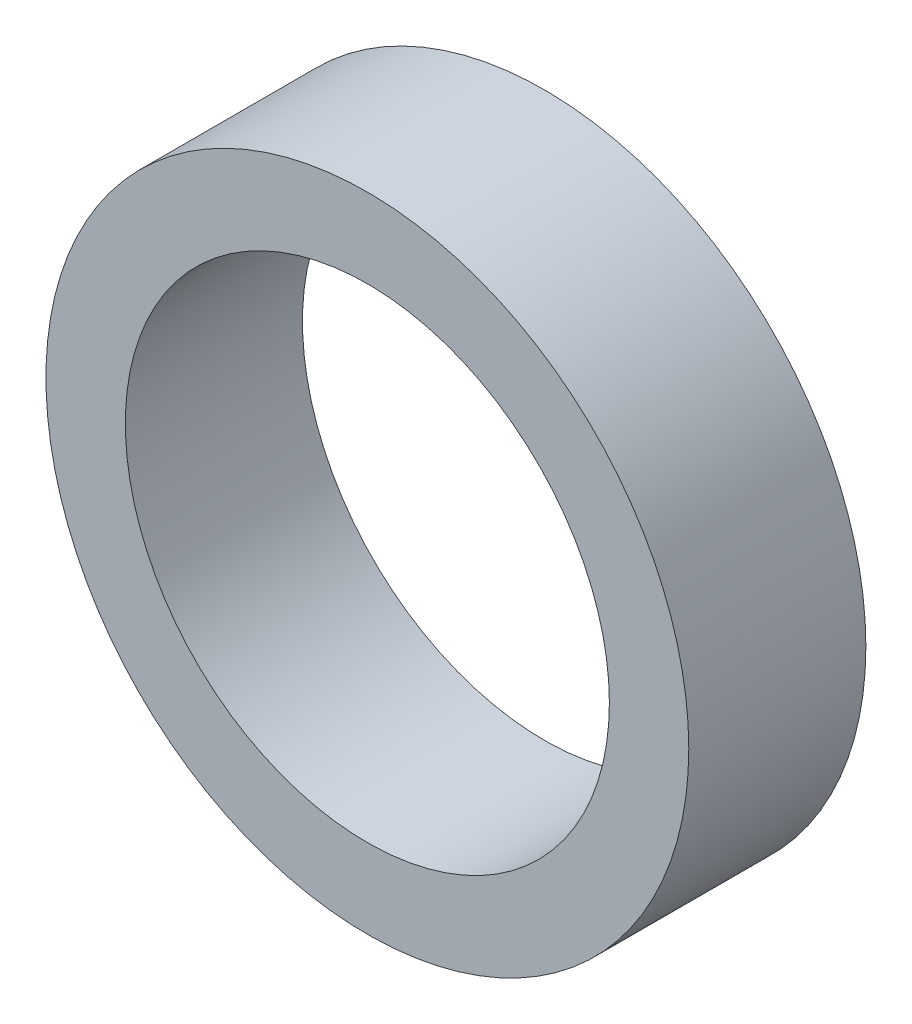
ISO-10303-21;
HEADER;
FILE_DESCRIPTION(('STEP AP214'),'2;1');
FILE_NAME('part.step','',(''),(''),'','','');
FILE_SCHEMA(('AUTOMOTIVE_DESIGN { 1 0 10303 214 1 1 1 1 }'));
ENDSEC;
DATA;
#1=APPLICATION_CONTEXT('core data for automotive mechanical design processes');
#2=APPLICATION_PROTOCOL_DEFINITION('international standard','automotive_design',2000,#1);
#3=PRODUCT_CONTEXT('',#1,'mechanical');
#4=PRODUCT('Part','Part','',(#3));
#5=PRODUCT_RELATED_PRODUCT_CATEGORY('part','',(#4));
#6=PRODUCT_DEFINITION_FORMATION('','',#4);
#7=PRODUCT_DEFINITION_CONTEXT('part definition',#1,'design');
#8=PRODUCT_DEFINITION('design','',#6,#7);
#9=PRODUCT_DEFINITION_SHAPE('','',#8);
#10=(LENGTH_UNIT() NAMED_UNIT(*) SI_UNIT(.MILLI.,.METRE.));
#11=(NAMED_UNIT(*) PLANE_ANGLE_UNIT() SI_UNIT($,.RADIAN.));
#12=(NAMED_UNIT(*) SI_UNIT($,.STERADIAN.) SOLID_ANGLE_UNIT());
#13=UNCERTAINTY_MEASURE_WITH_UNIT(LENGTH_MEASURE(1.E-05),#10,'distance_accuracy_value','');
#14=(GEOMETRIC_REPRESENTATION_CONTEXT(3) GLOBAL_UNCERTAINTY_ASSIGNED_CONTEXT((#13)) GLOBAL_UNIT_ASSIGNED_CONTEXT((#10,
#11,#12)) REPRESENTATION_CONTEXT('',''));
#15=CARTESIAN_POINT('',(0.,0.,0.));
#16=DIRECTION('',(0.,0.,1.));
#17=DIRECTION('',(1.,0.,0.));
#18=AXIS2_PLACEMENT_3D('',#15,#16,#17);
#19=CARTESIAN_POINT('',(0.,0.,3.));
#20=DIRECTION('',(0.,0.,1.));
#21=DIRECTION('',(1.,0.,0.));
#22=AXIS2_PLACEMENT_3D('',#19,#20,#21);
#23=PLANE('',#22);
#24=CARTESIAN_POINT('',(0.,0.,3.));
#25=DIRECTION('',(0.,0.,1.));
#26=DIRECTION('',(1.,0.,0.));
#27=AXIS2_PLACEMENT_3D('',#24,#25,#26);
#28=CIRCLE('',#27,5.445);
#29=CARTESIAN_POINT('',(5.445,0.,3.));
#30=VERTEX_POINT('',#29);
#31=EDGE_CURVE('E10',#30,#30,#28,.T.);
#32=ORIENTED_EDGE('',*,*,#31,.T.);
#33=EDGE_LOOP('',(#32));
#34=FACE_BOUND('',#33,.T.);
#35=CARTESIAN_POINT('',(0.,0.,3.));
#36=DIRECTION('',(0.,0.,1.));
#37=DIRECTION('',(1.,0.,0.));
#38=AXIS2_PLACEMENT_3D('',#35,#36,#37);
#39=CIRCLE('',#38,4.1);
#40=CARTESIAN_POINT('',(4.1,0.,3.));
#41=VERTEX_POINT('',#40);
#42=EDGE_CURVE('E41',#41,#41,#39,.T.);
#43=ORIENTED_EDGE('',*,*,#42,.F.);
#44=EDGE_LOOP('',(#43));
#45=FACE_BOUND('',#44,.T.);
#46=ADVANCED_FACE('F30',(#34,#45),#23,.T.);
#47=CARTESIAN_POINT('',(0.,0.,0.));
#48=DIRECTION('',(0.,0.,1.));
#49=DIRECTION('',(1.,0.,0.));
#50=AXIS2_PLACEMENT_3D('',#47,#48,#49);
#51=PLANE('',#50);
#52=CARTESIAN_POINT('',(0.,0.,0.));
#53=DIRECTION('',(0.,0.,1.));
#54=DIRECTION('',(1.,0.,0.));
#55=AXIS2_PLACEMENT_3D('',#52,#53,#54);
#56=CIRCLE('',#55,5.445);
#57=CARTESIAN_POINT('',(5.445,0.,0.));
#58=VERTEX_POINT('',#57);
#59=EDGE_CURVE('E34',#58,#58,#56,.T.);
#60=ORIENTED_EDGE('',*,*,#59,.F.);
#61=EDGE_LOOP('',(#60));
#62=FACE_BOUND('',#61,.T.);
#63=CARTESIAN_POINT('',(0.,0.,0.));
#64=DIRECTION('',(0.,0.,1.));
#65=DIRECTION('',(1.,0.,0.));
#66=AXIS2_PLACEMENT_3D('',#63,#64,#65);
#67=CIRCLE('',#66,4.1);
#68=CARTESIAN_POINT('',(4.1,0.,0.));
#69=VERTEX_POINT('',#68);
#70=EDGE_CURVE('E43',#69,#69,#67,.T.);
#71=ORIENTED_EDGE('',*,*,#70,.T.);
#72=EDGE_LOOP('',(#71));
#73=FACE_BOUND('',#72,.T.);
#74=ADVANCED_FACE('F53',(#62,#73),#51,.F.);
#75=CARTESIAN_POINT('',(0.,0.,3.));
#76=DIRECTION('',(0.,0.,-1.));
#77=DIRECTION('',(-1.,0.,0.));
#78=AXIS2_PLACEMENT_3D('',#75,#76,#77);
#79=CYLINDRICAL_SURFACE('',#78,5.445);
#80=ORIENTED_EDGE('',*,*,#31,.F.);
#81=EDGE_LOOP('',(#80));
#82=FACE_BOUND('',#81,.T.);
#83=ORIENTED_EDGE('',*,*,#59,.T.);
#84=EDGE_LOOP('',(#83));
#85=FACE_BOUND('',#84,.T.);
#86=ADVANCED_FACE('F32',(#82,#85),#79,.T.);
#87=CARTESIAN_POINT('',(0.,0.,3.));
#88=DIRECTION('',(0.,0.,-1.));
#89=DIRECTION('',(-1.,0.,0.));
#90=AXIS2_PLACEMENT_3D('',#87,#88,#89);
#91=CYLINDRICAL_SURFACE('',#90,4.1);
#92=ORIENTED_EDGE('',*,*,#42,.T.);
#93=EDGE_LOOP('',(#92));
#94=FACE_BOUND('',#93,.T.);
#95=ORIENTED_EDGE('',*,*,#70,.F.);
#96=EDGE_LOOP('',(#95));
#97=FACE_BOUND('',#96,.T.);
#98=ADVANCED_FACE('F49',(#94,#97),#91,.F.);
#99=CLOSED_SHELL('',(#46,#74,#86,#98));
#100=MANIFOLD_SOLID_BREP('B2',#99);
#101=ADVANCED_BREP_SHAPE_REPRESENTATION('',(#18,#100),#14);
#102=SHAPE_DEFINITION_REPRESENTATION(#9,#101);
ENDSEC;
END-ISO-10303-21;
